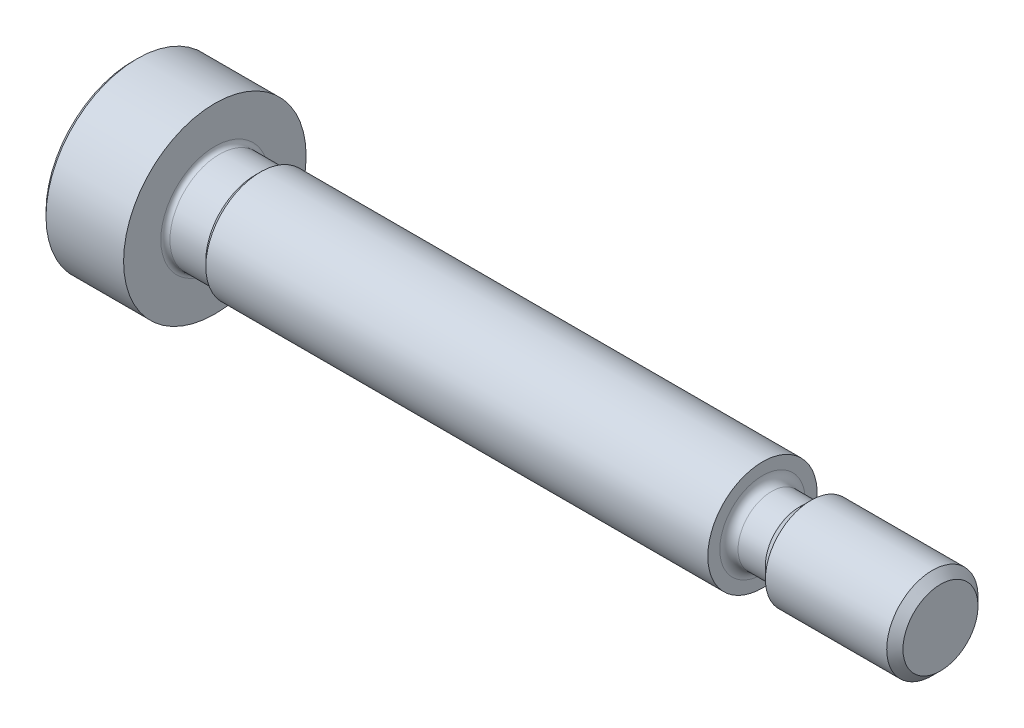
ISO-10303-21;
HEADER;
FILE_DESCRIPTION(('STEP AP214'),'2;1');
FILE_NAME('part.step','',(''),(''),'','','');
FILE_SCHEMA(('AUTOMOTIVE_DESIGN { 1 0 10303 214 1 1 1 1 }'));
ENDSEC;
DATA;
#1=APPLICATION_CONTEXT('core data for automotive mechanical design processes');
#2=APPLICATION_PROTOCOL_DEFINITION('international standard','automotive_design',2000,#1);
#3=PRODUCT_CONTEXT('',#1,'mechanical');
#4=PRODUCT('Part','Part','',(#3));
#5=PRODUCT_RELATED_PRODUCT_CATEGORY('part','',(#4));
#6=PRODUCT_DEFINITION_FORMATION('','',#4);
#7=PRODUCT_DEFINITION_CONTEXT('part definition',#1,'design');
#8=PRODUCT_DEFINITION('design','',#6,#7);
#9=PRODUCT_DEFINITION_SHAPE('','',#8);
#10=(LENGTH_UNIT() NAMED_UNIT(*) SI_UNIT(.MILLI.,.METRE.));
#11=(NAMED_UNIT(*) PLANE_ANGLE_UNIT() SI_UNIT($,.RADIAN.));
#12=(NAMED_UNIT(*) SI_UNIT($,.STERADIAN.) SOLID_ANGLE_UNIT());
#13=UNCERTAINTY_MEASURE_WITH_UNIT(LENGTH_MEASURE(1.E-05),#10,'distance_accuracy_value','');
#14=(GEOMETRIC_REPRESENTATION_CONTEXT(3) GLOBAL_UNCERTAINTY_ASSIGNED_CONTEXT((#13)) GLOBAL_UNIT_ASSIGNED_CONTEXT((#10,
#11,#12)) REPRESENTATION_CONTEXT('',''));
#15=CARTESIAN_POINT('',(0.,0.,0.));
#16=DIRECTION('',(0.,0.,1.));
#17=DIRECTION('',(1.,0.,0.));
#18=AXIS2_PLACEMENT_3D('',#15,#16,#17);
#19=CARTESIAN_POINT('',(0.,0.,0.));
#20=DIRECTION('',(-1.,0.,0.));
#21=DIRECTION('',(0.,0.,1.));
#22=AXIS2_PLACEMENT_3D('',#19,#20,#21);
#23=PLANE('',#22);
#24=CARTESIAN_POINT('',(0.,0.,0.));
#25=DIRECTION('',(-1.,0.,0.));
#26=DIRECTION('',(0.,0.,1.));
#27=AXIS2_PLACEMENT_3D('',#24,#25,#26);
#28=CIRCLE('',#27,4.75);
#29=CARTESIAN_POINT('',(0.,0.,4.75));
#30=VERTEX_POINT('',#29);
#31=EDGE_CURVE('E46',#30,#30,#28,.T.);
#32=ORIENTED_EDGE('',*,*,#31,.T.);
#33=EDGE_LOOP('',(#32));
#34=FACE_BOUND('',#33,.T.);
#35=DIRECTION('',(0.,-0.500000000000001,-0.866025403784438));
#36=VECTOR('',#35,1.);
#37=CARTESIAN_POINT('',(0.,-0.889119414552023,1.54));
#38=LINE('',#37,#36);
#39=CARTESIAN_POINT('',(0.,-0.889119414552023,1.54));
#40=VERTEX_POINT('',#39);
#41=CARTESIAN_POINT('',(0.,-1.77823882910405,0.));
#42=VERTEX_POINT('',#41);
#43=EDGE_CURVE('E53',#40,#42,#38,.T.);
#44=ORIENTED_EDGE('',*,*,#43,.T.);
#45=DIRECTION('',(0.,0.500000000000001,-0.866025403784438));
#46=VECTOR('',#45,1.);
#47=CARTESIAN_POINT('',(0.,-1.77823882910405,0.));
#48=LINE('',#47,#46);
#49=CARTESIAN_POINT('',(0.,-0.889119414552023,-1.54));
#50=VERTEX_POINT('',#49);
#51=EDGE_CURVE('E328',#42,#50,#48,.T.);
#52=ORIENTED_EDGE('',*,*,#51,.T.);
#53=DIRECTION('',(0.,1.,0.));
#54=VECTOR('',#53,1.);
#55=CARTESIAN_POINT('',(0.,-0.889119414552023,-1.54));
#56=LINE('',#55,#54);
#57=CARTESIAN_POINT('',(0.,0.889119414552021,-1.54));
#58=VERTEX_POINT('',#57);
#59=EDGE_CURVE('E133',#50,#58,#56,.T.);
#60=ORIENTED_EDGE('',*,*,#59,.T.);
#61=DIRECTION('',(0.,0.500000000000002,0.866025403784438));
#62=VECTOR('',#61,1.);
#63=CARTESIAN_POINT('',(0.,0.889119414552021,-1.54));
#64=LINE('',#63,#62);
#65=CARTESIAN_POINT('',(0.,1.77823882910405,0.));
#66=VERTEX_POINT('',#65);
#67=EDGE_CURVE('E331',#58,#66,#64,.T.);
#68=ORIENTED_EDGE('',*,*,#67,.T.);
#69=DIRECTION('',(0.,-0.500000000000002,0.866025403784438));
#70=VECTOR('',#69,1.);
#71=CARTESIAN_POINT('',(0.,1.77823882910405,0.));
#72=LINE('',#71,#70);
#73=CARTESIAN_POINT('',(0.,0.889119414552021,1.54));
#74=VERTEX_POINT('',#73);
#75=EDGE_CURVE('E333',#66,#74,#72,.T.);
#76=ORIENTED_EDGE('',*,*,#75,.T.);
#77=DIRECTION('',(0.,-1.,0.));
#78=VECTOR('',#77,1.);
#79=CARTESIAN_POINT('',(0.,0.889119414552021,1.54));
#80=LINE('',#79,#78);
#81=EDGE_CURVE('E335',#74,#40,#80,.T.);
#82=ORIENTED_EDGE('',*,*,#81,.T.);
#83=EDGE_LOOP('',(#44,#52,#60,#68,#76,#82));
#84=FACE_BOUND('',#83,.T.);
#85=ADVANCED_FACE('F38',(#34,#84),#23,.T.);
#86=CARTESIAN_POINT('',(-6.34999999999999,0.,0.));
#87=DIRECTION('',(-1.,0.,0.));
#88=DIRECTION('',(0.,0.,1.));
#89=AXIS2_PLACEMENT_3D('',#86,#87,#88);
#90=CYLINDRICAL_SURFACE('',#89,5.);
#91=CARTESIAN_POINT('',(0.250000000000001,0.,0.));
#92=DIRECTION('',(-1.,0.,0.));
#93=DIRECTION('',(0.,0.,1.));
#94=AXIS2_PLACEMENT_3D('',#91,#92,#93);
#95=CIRCLE('',#94,5.);
#96=CARTESIAN_POINT('',(0.250000000000001,0.,5.));
#97=VERTEX_POINT('',#96);
#98=EDGE_CURVE('E11',#97,#97,#95,.F.);
#99=ORIENTED_EDGE('',*,*,#98,.T.);
#100=EDGE_LOOP('',(#99));
#101=FACE_BOUND('',#100,.T.);
#102=CARTESIAN_POINT('',(4.5,0.,0.));
#103=DIRECTION('',(-1.,0.,0.));
#104=DIRECTION('',(0.,0.,1.));
#105=AXIS2_PLACEMENT_3D('',#102,#103,#104);
#106=CIRCLE('',#105,5.);
#107=CARTESIAN_POINT('',(4.5,0.,5.));
#108=VERTEX_POINT('',#107);
#109=EDGE_CURVE('E180',#108,#108,#106,.T.);
#110=ORIENTED_EDGE('',*,*,#109,.T.);
#111=EDGE_LOOP('',(#110));
#112=FACE_BOUND('',#111,.T.);
#113=ADVANCED_FACE('F199',(#101,#112),#90,.T.);
#114=CARTESIAN_POINT('',(4.5,5.,0.));
#115=DIRECTION('',(1.,0.,0.));
#116=DIRECTION('',(0.,0.,-1.));
#117=AXIS2_PLACEMENT_3D('',#114,#115,#116);
#118=PLANE('',#117);
#119=CARTESIAN_POINT('',(4.5,0.,0.));
#120=DIRECTION('',(-1.,0.,0.));
#121=DIRECTION('',(0.,0.,1.));
#122=AXIS2_PLACEMENT_3D('',#119,#120,#121);
#123=CIRCLE('',#122,2.96);
#124=CARTESIAN_POINT('',(4.5,0.,2.96));
#125=VERTEX_POINT('',#124);
#126=EDGE_CURVE('E177',#125,#125,#123,.T.);
#127=ORIENTED_EDGE('',*,*,#126,.T.);
#128=EDGE_LOOP('',(#127));
#129=FACE_BOUND('',#128,.T.);
#130=ORIENTED_EDGE('',*,*,#109,.F.);
#131=EDGE_LOOP('',(#130));
#132=FACE_BOUND('',#131,.T.);
#133=ADVANCED_FACE('F203',(#129,#132),#118,.T.);
#134=CARTESIAN_POINT('',(4.75,0.,0.));
#135=DIRECTION('',(-1.,0.,0.));
#136=DIRECTION('',(0.,0.,1.));
#137=AXIS2_PLACEMENT_3D('',#134,#135,#136);
#138=TOROIDAL_SURFACE('',#137,2.96,0.25);
#139=ORIENTED_EDGE('',*,*,#126,.F.);
#140=EDGE_LOOP('',(#139));
#141=FACE_BOUND('',#140,.T.);
#142=CARTESIAN_POINT('',(4.75,0.,0.));
#143=DIRECTION('',(-1.,0.,0.));
#144=DIRECTION('',(0.,0.,1.));
#145=AXIS2_PLACEMENT_3D('',#142,#143,#144);
#146=CIRCLE('',#145,2.71);
#147=CARTESIAN_POINT('',(4.75,0.,2.71));
#148=VERTEX_POINT('',#147);
#149=EDGE_CURVE('E174',#148,#148,#146,.T.);
#150=ORIENTED_EDGE('',*,*,#149,.T.);
#151=EDGE_LOOP('',(#150));
#152=FACE_BOUND('',#151,.T.);
#153=ADVANCED_FACE('F209',(#141,#152),#138,.F.);
#154=CARTESIAN_POINT('',(-6.34999999999999,0.,0.));
#155=DIRECTION('',(-1.,0.,0.));
#156=DIRECTION('',(0.,0.,1.));
#157=AXIS2_PLACEMENT_3D('',#154,#155,#156);
#158=CYLINDRICAL_SURFACE('',#157,2.71);
#159=CARTESIAN_POINT('',(6.715,0.,0.));
#160=DIRECTION('',(-1.,0.,0.));
#161=DIRECTION('',(0.,0.,1.));
#162=AXIS2_PLACEMENT_3D('',#159,#160,#161);
#163=CIRCLE('',#162,2.71);
#164=CARTESIAN_POINT('',(6.715,0.,2.71));
#165=VERTEX_POINT('',#164);
#166=EDGE_CURVE('E171',#165,#165,#163,.T.);
#167=ORIENTED_EDGE('',*,*,#166,.T.);
#168=EDGE_LOOP('',(#167));
#169=FACE_BOUND('',#168,.T.);
#170=ORIENTED_EDGE('',*,*,#149,.F.);
#171=EDGE_LOOP('',(#170));
#172=FACE_BOUND('',#171,.T.);
#173=ADVANCED_FACE('F213',(#169,#172),#158,.T.);
#174=CARTESIAN_POINT('',(6.715,0.,0.));
#175=DIRECTION('',(1.,0.,0.));
#176=DIRECTION('',(0.,0.,-1.));
#177=AXIS2_PLACEMENT_3D('',#174,#175,#176);
#178=CONICAL_SURFACE('',#177,2.71,0.785398163397451);
#179=CARTESIAN_POINT('',(7.,0.,0.));
#180=DIRECTION('',(-1.,0.,0.));
#181=DIRECTION('',(0.,0.,1.));
#182=AXIS2_PLACEMENT_3D('',#179,#180,#181);
#183=CIRCLE('',#182,2.995);
#184=CARTESIAN_POINT('',(7.,0.,2.995));
#185=VERTEX_POINT('',#184);
#186=EDGE_CURVE('E168',#185,#185,#183,.T.);
#187=ORIENTED_EDGE('',*,*,#186,.T.);
#188=EDGE_LOOP('',(#187));
#189=FACE_BOUND('',#188,.T.);
#190=ORIENTED_EDGE('',*,*,#166,.F.);
#191=EDGE_LOOP('',(#190));
#192=FACE_BOUND('',#191,.T.);
#193=ADVANCED_FACE('F217',(#189,#192),#178,.T.);
#194=CARTESIAN_POINT('',(-6.34999999999999,0.,0.));
#195=DIRECTION('',(-1.,0.,0.));
#196=DIRECTION('',(0.,0.,1.));
#197=AXIS2_PLACEMENT_3D('',#194,#195,#196);
#198=CYLINDRICAL_SURFACE('',#197,2.995);
#199=CARTESIAN_POINT('',(34.5,0.,0.));
#200=DIRECTION('',(-1.,0.,0.));
#201=DIRECTION('',(0.,0.,1.));
#202=AXIS2_PLACEMENT_3D('',#199,#200,#201);
#203=CIRCLE('',#202,2.995);
#204=CARTESIAN_POINT('',(34.5,0.,2.995));
#205=VERTEX_POINT('',#204);
#206=EDGE_CURVE('E165',#205,#205,#203,.T.);
#207=ORIENTED_EDGE('',*,*,#206,.T.);
#208=EDGE_LOOP('',(#207));
#209=FACE_BOUND('',#208,.T.);
#210=ORIENTED_EDGE('',*,*,#186,.F.);
#211=EDGE_LOOP('',(#210));
#212=FACE_BOUND('',#211,.T.);
#213=ADVANCED_FACE('F221',(#209,#212),#198,.T.);
#214=CARTESIAN_POINT('',(34.5,2.995,0.));
#215=DIRECTION('',(1.,0.,0.));
#216=DIRECTION('',(0.,0.,-1.));
#217=AXIS2_PLACEMENT_3D('',#214,#215,#216);
#218=PLANE('',#217);
#219=CARTESIAN_POINT('',(34.5,0.,0.));
#220=DIRECTION('',(-1.,0.,0.));
#221=DIRECTION('',(0.,0.,1.));
#222=AXIS2_PLACEMENT_3D('',#219,#220,#221);
#223=CIRCLE('',#222,2.34);
#224=CARTESIAN_POINT('',(34.5,0.,2.34));
#225=VERTEX_POINT('',#224);
#226=EDGE_CURVE('E162',#225,#225,#223,.T.);
#227=ORIENTED_EDGE('',*,*,#226,.T.);
#228=EDGE_LOOP('',(#227));
#229=FACE_BOUND('',#228,.T.);
#230=ORIENTED_EDGE('',*,*,#206,.F.);
#231=EDGE_LOOP('',(#230));
#232=FACE_BOUND('',#231,.T.);
#233=ADVANCED_FACE('F225',(#229,#232),#218,.T.);
#234=CARTESIAN_POINT('',(35.,0.,0.));
#235=DIRECTION('',(-1.,0.,0.));
#236=DIRECTION('',(0.,0.,1.));
#237=AXIS2_PLACEMENT_3D('',#234,#235,#236);
#238=TOROIDAL_SURFACE('',#237,2.34,0.5);
#239=CARTESIAN_POINT('',(35.,0.,0.));
#240=DIRECTION('',(-1.,0.,0.));
#241=DIRECTION('',(0.,0.,1.));
#242=AXIS2_PLACEMENT_3D('',#239,#240,#241);
#243=CIRCLE('',#242,1.84);
#244=CARTESIAN_POINT('',(35.,0.,1.84));
#245=VERTEX_POINT('',#244);
#246=EDGE_CURVE('E159',#245,#245,#243,.T.);
#247=ORIENTED_EDGE('',*,*,#246,.T.);
#248=EDGE_LOOP('',(#247));
#249=FACE_BOUND('',#248,.T.);
#250=ORIENTED_EDGE('',*,*,#226,.F.);
#251=EDGE_LOOP('',(#250));
#252=FACE_BOUND('',#251,.T.);
#253=ADVANCED_FACE('F229',(#249,#252),#238,.F.);
#254=CARTESIAN_POINT('',(-6.34999999999999,0.,0.));
#255=DIRECTION('',(-1.,0.,0.));
#256=DIRECTION('',(0.,0.,1.));
#257=AXIS2_PLACEMENT_3D('',#254,#255,#256);
#258=CYLINDRICAL_SURFACE('',#257,1.84);
#259=CARTESIAN_POINT('',(36.5,0.,0.));
#260=DIRECTION('',(-1.,0.,0.));
#261=DIRECTION('',(0.,0.,1.));
#262=AXIS2_PLACEMENT_3D('',#259,#260,#261);
#263=CIRCLE('',#262,1.84);
#264=CARTESIAN_POINT('',(36.5,0.,1.84));
#265=VERTEX_POINT('',#264);
#266=EDGE_CURVE('E156',#265,#265,#263,.T.);
#267=ORIENTED_EDGE('',*,*,#266,.T.);
#268=EDGE_LOOP('',(#267));
#269=FACE_BOUND('',#268,.T.);
#270=ORIENTED_EDGE('',*,*,#246,.F.);
#271=EDGE_LOOP('',(#270));
#272=FACE_BOUND('',#271,.T.);
#273=ADVANCED_FACE('F233',(#269,#272),#258,.T.);
#274=CARTESIAN_POINT('',(36.5,0.,0.));
#275=DIRECTION('',(1.,0.,0.));
#276=DIRECTION('',(0.,0.,-1.));
#277=AXIS2_PLACEMENT_3D('',#274,#275,#276);
#278=CONICAL_SURFACE('',#277,1.84,0.785398163397442);
#279=CARTESIAN_POINT('',(37.16,0.,0.));
#280=DIRECTION('',(-1.,0.,0.));
#281=DIRECTION('',(0.,0.,1.));
#282=AXIS2_PLACEMENT_3D('',#279,#280,#281);
#283=CIRCLE('',#282,2.5);
#284=CARTESIAN_POINT('',(37.16,0.,2.5));
#285=VERTEX_POINT('',#284);
#286=EDGE_CURVE('E153',#285,#285,#283,.T.);
#287=ORIENTED_EDGE('',*,*,#286,.T.);
#288=EDGE_LOOP('',(#287));
#289=FACE_BOUND('',#288,.T.);
#290=ORIENTED_EDGE('',*,*,#266,.F.);
#291=EDGE_LOOP('',(#290));
#292=FACE_BOUND('',#291,.T.);
#293=ADVANCED_FACE('F237',(#289,#292),#278,.T.);
#294=CARTESIAN_POINT('',(-6.34999999999999,0.,0.));
#295=DIRECTION('',(-1.,0.,0.));
#296=DIRECTION('',(0.,0.,1.));
#297=AXIS2_PLACEMENT_3D('',#294,#295,#296);
#298=CYLINDRICAL_SURFACE('',#297,2.5);
#299=CARTESIAN_POINT('',(43.805,0.,0.));
#300=DIRECTION('',(-1.,0.,0.));
#301=DIRECTION('',(0.,0.,1.));
#302=AXIS2_PLACEMENT_3D('',#299,#300,#301);
#303=CIRCLE('',#302,2.5);
#304=CARTESIAN_POINT('',(43.805,0.,2.5));
#305=VERTEX_POINT('',#304);
#306=EDGE_CURVE('E150',#305,#305,#303,.T.);
#307=ORIENTED_EDGE('',*,*,#306,.T.);
#308=EDGE_LOOP('',(#307));
#309=FACE_BOUND('',#308,.T.);
#310=ORIENTED_EDGE('',*,*,#286,.F.);
#311=EDGE_LOOP('',(#310));
#312=FACE_BOUND('',#311,.T.);
#313=ADVANCED_FACE('F241',(#309,#312),#298,.T.);
#314=CARTESIAN_POINT('',(43.805,0.,0.));
#315=DIRECTION('',(-1.,0.,0.));
#316=DIRECTION('',(0.,0.,1.));
#317=AXIS2_PLACEMENT_3D('',#314,#315,#316);
#318=CONICAL_SURFACE('',#317,2.5,0.785398163397427);
#319=CARTESIAN_POINT('',(44.25,0.,0.));
#320=DIRECTION('',(-1.,0.,0.));
#321=DIRECTION('',(0.,0.,1.));
#322=AXIS2_PLACEMENT_3D('',#319,#320,#321);
#323=CIRCLE('',#322,2.055);
#324=CARTESIAN_POINT('',(44.25,0.,2.055));
#325=VERTEX_POINT('',#324);
#326=EDGE_CURVE('E146',#325,#325,#323,.T.);
#327=ORIENTED_EDGE('',*,*,#326,.T.);
#328=EDGE_LOOP('',(#327));
#329=FACE_BOUND('',#328,.T.);
#330=ORIENTED_EDGE('',*,*,#306,.F.);
#331=EDGE_LOOP('',(#330));
#332=FACE_BOUND('',#331,.T.);
#333=ADVANCED_FACE('F194',(#329,#332),#318,.T.);
#334=CARTESIAN_POINT('',(44.25,2.055,0.));
#335=DIRECTION('',(1.,0.,0.));
#336=DIRECTION('',(0.,0.,-1.));
#337=AXIS2_PLACEMENT_3D('',#334,#335,#336);
#338=PLANE('',#337);
#339=ORIENTED_EDGE('',*,*,#326,.F.);
#340=EDGE_LOOP('',(#339));
#341=FACE_BOUND('',#340,.T.);
#342=ADVANCED_FACE('F187',(#341),#338,.T.);
#343=CARTESIAN_POINT('',(0.,0.,0.));
#344=DIRECTION('',(1.,0.,0.));
#345=DIRECTION('',(0.,0.,-1.));
#346=AXIS2_PLACEMENT_3D('',#343,#344,#345);
#347=CONICAL_SURFACE('',#346,4.75,0.785398163397447);
#348=ORIENTED_EDGE('',*,*,#98,.F.);
#349=EDGE_LOOP('',(#348));
#350=FACE_BOUND('',#349,.T.);
#351=ORIENTED_EDGE('',*,*,#31,.F.);
#352=EDGE_LOOP('',(#351));
#353=FACE_BOUND('',#352,.T.);
#354=ADVANCED_FACE('F40',(#350,#353),#347,.T.);
#355=CARTESIAN_POINT('',(2.4,-1.77823882910405,0.));
#356=DIRECTION('',(0.,0.866025403784438,0.500000000000001));
#357=DIRECTION('',(0.,-0.500000000000001,0.866025403784438));
#358=AXIS2_PLACEMENT_3D('',#355,#356,#357);
#359=PLANE('',#358);
#360=DIRECTION('',(0.,0.500000000000001,-0.866025403784438));
#361=VECTOR('',#360,1.);
#362=CARTESIAN_POINT('',(2.4,-1.77823882910405,0.));
#363=LINE('',#362,#361);
#364=CARTESIAN_POINT('',(2.4,-1.77823882910405,0.));
#365=VERTEX_POINT('',#364);
#366=CARTESIAN_POINT('',(2.4,-1.33367912182803,-0.770000000000002));
#367=VERTEX_POINT('',#366);
#368=EDGE_CURVE('E61',#365,#367,#363,.T.);
#369=ORIENTED_EDGE('',*,*,#368,.T.);
#370=CARTESIAN_POINT('',(2.4,-0.889119414552023,-1.54));
#371=VERTEX_POINT('',#370);
#372=EDGE_CURVE('E111',#367,#371,#363,.T.);
#373=ORIENTED_EDGE('',*,*,#372,.T.);
#374=DIRECTION('',(-1.,0.,0.));
#375=VECTOR('',#374,1.);
#376=CARTESIAN_POINT('',(2.4,-0.889119414552023,-1.54));
#377=LINE('',#376,#375);
#378=EDGE_CURVE('E115',#371,#50,#377,.T.);
#379=ORIENTED_EDGE('',*,*,#378,.T.);
#380=ORIENTED_EDGE('',*,*,#51,.F.);
#381=DIRECTION('',(-1.,0.,0.));
#382=VECTOR('',#381,1.);
#383=CARTESIAN_POINT('',(2.4,-1.77823882910405,0.));
#384=LINE('',#383,#382);
#385=EDGE_CURVE('E327',#365,#42,#384,.T.);
#386=ORIENTED_EDGE('',*,*,#385,.F.);
#387=EDGE_LOOP('',(#369,#373,#379,#380,#386));
#388=FACE_BOUND('',#387,.T.);
#389=ADVANCED_FACE('F113',(#388),#359,.T.);
#390=CARTESIAN_POINT('',(2.4,-0.889119414552023,-1.54));
#391=DIRECTION('',(0.,0.,1.));
#392=DIRECTION('',(0.,-1.,0.));
#393=AXIS2_PLACEMENT_3D('',#390,#391,#392);
#394=PLANE('',#393);
#395=DIRECTION('',(0.,1.,0.));
#396=VECTOR('',#395,1.);
#397=CARTESIAN_POINT('',(2.4,-0.889119414552023,-1.54));
#398=LINE('',#397,#396);
#399=CARTESIAN_POINT('',(2.4,0.,-1.54));
#400=VERTEX_POINT('',#399);
#401=EDGE_CURVE('E120',#371,#400,#398,.T.);
#402=ORIENTED_EDGE('',*,*,#401,.T.);
#403=CARTESIAN_POINT('',(2.4,0.889119414552021,-1.54));
#404=VERTEX_POINT('',#403);
#405=EDGE_CURVE('E128',#400,#404,#398,.T.);
#406=ORIENTED_EDGE('',*,*,#405,.T.);
#407=DIRECTION('',(-1.,0.,0.));
#408=VECTOR('',#407,1.);
#409=CARTESIAN_POINT('',(2.4,0.889119414552021,-1.54));
#410=LINE('',#409,#408);
#411=EDGE_CURVE('E135',#404,#58,#410,.T.);
#412=ORIENTED_EDGE('',*,*,#411,.T.);
#413=ORIENTED_EDGE('',*,*,#59,.F.);
#414=ORIENTED_EDGE('',*,*,#378,.F.);
#415=EDGE_LOOP('',(#402,#406,#412,#413,#414));
#416=FACE_BOUND('',#415,.T.);
#417=ADVANCED_FACE('F131',(#416),#394,.T.);
#418=CARTESIAN_POINT('',(2.4,0.889119414552021,-1.54));
#419=DIRECTION('',(0.,-0.866025403784438,0.500000000000002));
#420=DIRECTION('',(0.,-0.500000000000002,-0.866025403784438));
#421=AXIS2_PLACEMENT_3D('',#418,#419,#420);
#422=PLANE('',#421);
#423=DIRECTION('',(0.,0.500000000000002,0.866025403784438));
#424=VECTOR('',#423,1.);
#425=CARTESIAN_POINT('',(2.4,0.889119414552021,-1.54));
#426=LINE('',#425,#424);
#427=CARTESIAN_POINT('',(2.4,1.33367912182803,-0.770000000000002));
#428=VERTEX_POINT('',#427);
#429=EDGE_CURVE('E291',#404,#428,#426,.T.);
#430=ORIENTED_EDGE('',*,*,#429,.T.);
#431=CARTESIAN_POINT('',(2.4,1.77823882910405,0.));
#432=VERTEX_POINT('',#431);
#433=EDGE_CURVE('E127',#428,#432,#426,.T.);
#434=ORIENTED_EDGE('',*,*,#433,.T.);
#435=DIRECTION('',(-1.,0.,0.));
#436=VECTOR('',#435,1.);
#437=CARTESIAN_POINT('',(2.4,1.77823882910405,0.));
#438=LINE('',#437,#436);
#439=EDGE_CURVE('E141',#432,#66,#438,.T.);
#440=ORIENTED_EDGE('',*,*,#439,.T.);
#441=ORIENTED_EDGE('',*,*,#67,.F.);
#442=ORIENTED_EDGE('',*,*,#411,.F.);
#443=EDGE_LOOP('',(#430,#434,#440,#441,#442));
#444=FACE_BOUND('',#443,.T.);
#445=ADVANCED_FACE('F255',(#444),#422,.T.);
#446=CARTESIAN_POINT('',(2.4,1.77823882910405,0.));
#447=DIRECTION('',(0.,-0.866025403784438,-0.500000000000002));
#448=DIRECTION('',(0.,0.500000000000002,-0.866025403784438));
#449=AXIS2_PLACEMENT_3D('',#446,#447,#448);
#450=PLANE('',#449);
#451=DIRECTION('',(0.,-0.500000000000002,0.866025403784438));
#452=VECTOR('',#451,1.);
#453=CARTESIAN_POINT('',(2.4,1.77823882910405,0.));
#454=LINE('',#453,#452);
#455=CARTESIAN_POINT('',(2.4,1.33367912182803,0.770000000000002));
#456=VERTEX_POINT('',#455);
#457=EDGE_CURVE('E296',#432,#456,#454,.T.);
#458=ORIENTED_EDGE('',*,*,#457,.T.);
#459=CARTESIAN_POINT('',(2.4,0.889119414552021,1.54));
#460=VERTEX_POINT('',#459);
#461=EDGE_CURVE('E302',#456,#460,#454,.T.);
#462=ORIENTED_EDGE('',*,*,#461,.T.);
#463=DIRECTION('',(-1.,0.,0.));
#464=VECTOR('',#463,1.);
#465=CARTESIAN_POINT('',(2.4,0.889119414552021,1.54));
#466=LINE('',#465,#464);
#467=EDGE_CURVE('E322',#460,#74,#466,.T.);
#468=ORIENTED_EDGE('',*,*,#467,.T.);
#469=ORIENTED_EDGE('',*,*,#75,.F.);
#470=ORIENTED_EDGE('',*,*,#439,.F.);
#471=EDGE_LOOP('',(#458,#462,#468,#469,#470));
#472=FACE_BOUND('',#471,.T.);
#473=ADVANCED_FACE('F258',(#472),#450,.T.);
#474=CARTESIAN_POINT('',(2.4,0.889119414552021,1.54));
#475=DIRECTION('',(0.,0.,-1.));
#476=DIRECTION('',(-1.,0.,0.));
#477=AXIS2_PLACEMENT_3D('',#474,#475,#476);
#478=PLANE('',#477);
#479=DIRECTION('',(0.,-1.,0.));
#480=VECTOR('',#479,1.);
#481=CARTESIAN_POINT('',(2.4,0.889119414552021,1.54));
#482=LINE('',#481,#480);
#483=CARTESIAN_POINT('',(2.4,0.,1.54));
#484=VERTEX_POINT('',#483);
#485=EDGE_CURVE('E309',#460,#484,#482,.T.);
#486=ORIENTED_EDGE('',*,*,#485,.T.);
#487=CARTESIAN_POINT('',(2.4,-0.889119414552023,1.54));
#488=VERTEX_POINT('',#487);
#489=EDGE_CURVE('E312',#484,#488,#482,.T.);
#490=ORIENTED_EDGE('',*,*,#489,.T.);
#491=DIRECTION('',(-1.,0.,0.));
#492=VECTOR('',#491,1.);
#493=CARTESIAN_POINT('',(2.4,-0.889119414552023,1.54));
#494=LINE('',#493,#492);
#495=EDGE_CURVE('E340',#488,#40,#494,.T.);
#496=ORIENTED_EDGE('',*,*,#495,.T.);
#497=ORIENTED_EDGE('',*,*,#81,.F.);
#498=ORIENTED_EDGE('',*,*,#467,.F.);
#499=EDGE_LOOP('',(#486,#490,#496,#497,#498));
#500=FACE_BOUND('',#499,.T.);
#501=ADVANCED_FACE('F262',(#500),#478,.T.);
#502=CARTESIAN_POINT('',(2.4,-0.889119414552023,1.54));
#503=DIRECTION('',(0.,0.866025403784438,-0.500000000000001));
#504=DIRECTION('',(0.,0.500000000000001,0.866025403784438));
#505=AXIS2_PLACEMENT_3D('',#502,#503,#504);
#506=PLANE('',#505);
#507=DIRECTION('',(0.,-0.500000000000001,-0.866025403784438));
#508=VECTOR('',#507,1.);
#509=CARTESIAN_POINT('',(2.4,-0.889119414552023,1.54));
#510=LINE('',#509,#508);
#511=CARTESIAN_POINT('',(2.4,-1.33367912182804,0.770000000000002));
#512=VERTEX_POINT('',#511);
#513=EDGE_CURVE('E315',#488,#512,#510,.T.);
#514=ORIENTED_EDGE('',*,*,#513,.T.);
#515=EDGE_CURVE('E323',#512,#365,#510,.T.);
#516=ORIENTED_EDGE('',*,*,#515,.T.);
#517=ORIENTED_EDGE('',*,*,#385,.T.);
#518=ORIENTED_EDGE('',*,*,#43,.F.);
#519=ORIENTED_EDGE('',*,*,#495,.F.);
#520=EDGE_LOOP('',(#514,#516,#517,#518,#519));
#521=FACE_BOUND('',#520,.T.);
#522=ADVANCED_FACE('F266',(#521),#506,.T.);
#523=CARTESIAN_POINT('',(2.4,0.,-3.07999999999999));
#524=DIRECTION('',(1.,0.,0.));
#525=DIRECTION('',(0.,0.,-1.));
#526=AXIS2_PLACEMENT_3D('',#523,#524,#525);
#527=PLANE('',#526);
#528=CARTESIAN_POINT('',(2.4,0.,0.));
#529=DIRECTION('',(-1.,0.,0.));
#530=DIRECTION('',(0.,0.,1.));
#531=AXIS2_PLACEMENT_3D('',#528,#529,#530);
#532=CIRCLE('',#531,1.54);
#533=EDGE_CURVE('E288',#428,#400,#532,.T.);
#534=ORIENTED_EDGE('',*,*,#533,.F.);
#535=ORIENTED_EDGE('',*,*,#429,.F.);
#536=ORIENTED_EDGE('',*,*,#405,.F.);
#537=EDGE_LOOP('',(#534,#535,#536));
#538=FACE_BOUND('',#537,.T.);
#539=ADVANCED_FACE('F270',(#538),#527,.F.);
#540=EDGE_CURVE('E147',#456,#428,#532,.T.);
#541=ORIENTED_EDGE('',*,*,#540,.F.);
#542=ORIENTED_EDGE('',*,*,#457,.F.);
#543=ORIENTED_EDGE('',*,*,#433,.F.);
#544=EDGE_LOOP('',(#541,#542,#543));
#545=FACE_BOUND('',#544,.T.);
#546=ADVANCED_FACE('F280',(#545),#527,.F.);
#547=EDGE_CURVE('E140',#484,#456,#532,.T.);
#548=ORIENTED_EDGE('',*,*,#547,.F.);
#549=ORIENTED_EDGE('',*,*,#485,.F.);
#550=ORIENTED_EDGE('',*,*,#461,.F.);
#551=EDGE_LOOP('',(#548,#549,#550));
#552=FACE_BOUND('',#551,.T.);
#553=ADVANCED_FACE('F285',(#552),#527,.F.);
#554=EDGE_CURVE('E134',#512,#484,#532,.T.);
#555=ORIENTED_EDGE('',*,*,#554,.F.);
#556=ORIENTED_EDGE('',*,*,#513,.F.);
#557=ORIENTED_EDGE('',*,*,#489,.F.);
#558=EDGE_LOOP('',(#555,#556,#557));
#559=FACE_BOUND('',#558,.T.);
#560=ADVANCED_FACE('F277',(#559),#527,.F.);
#561=EDGE_CURVE('E138',#367,#512,#532,.T.);
#562=ORIENTED_EDGE('',*,*,#561,.F.);
#563=ORIENTED_EDGE('',*,*,#368,.F.);
#564=ORIENTED_EDGE('',*,*,#515,.F.);
#565=EDGE_LOOP('',(#562,#563,#564));
#566=FACE_BOUND('',#565,.T.);
#567=ADVANCED_FACE('F273',(#566),#527,.F.);
#568=EDGE_CURVE('E123',#400,#367,#532,.T.);
#569=ORIENTED_EDGE('',*,*,#568,.F.);
#570=ORIENTED_EDGE('',*,*,#401,.F.);
#571=ORIENTED_EDGE('',*,*,#372,.F.);
#572=EDGE_LOOP('',(#569,#570,#571));
#573=FACE_BOUND('',#572,.T.);
#574=ADVANCED_FACE('F121',(#573),#527,.F.);
#575=CARTESIAN_POINT('',(3.28911941455203,0.,0.));
#576=DIRECTION('',(-1.,0.,0.));
#577=DIRECTION('',(0.,0.,1.));
#578=AXIS2_PLACEMENT_3D('',#575,#576,#577);
#579=CONICAL_SURFACE('',#578,0.,1.04719755119659);
#580=ORIENTED_EDGE('',*,*,#547,.T.);
#581=ORIENTED_EDGE('',*,*,#540,.T.);
#582=ORIENTED_EDGE('',*,*,#533,.T.);
#583=ORIENTED_EDGE('',*,*,#568,.T.);
#584=ORIENTED_EDGE('',*,*,#561,.T.);
#585=ORIENTED_EDGE('',*,*,#554,.T.);
#586=EDGE_LOOP('',(#580,#581,#582,#583,#584,#585));
#587=FACE_BOUND('',#586,.T.);
#588=CARTESIAN_POINT('',(3.28911941455203,0.,0.));
#589=VERTEX_POINT('',#588);
#590=VERTEX_LOOP('',#589);
#591=FACE_BOUND('',#590,.T.);
#592=ADVANCED_FACE('F249',(#587,#591),#579,.F.);
#593=CLOSED_SHELL('',(#85,#113,#133,#153,#173,#193,#213,#233,#253,#273,#293,#313,#333,#342,#354,
#389,#417,#445,#473,#501,#522,#539,#546,#553,#560,#567,#574,#592));
#594=MANIFOLD_SOLID_BREP('B2',#593);
#595=ADVANCED_BREP_SHAPE_REPRESENTATION('',(#18,#594),#14);
#596=SHAPE_DEFINITION_REPRESENTATION(#9,#595);
ENDSEC;
END-ISO-10303-21;
